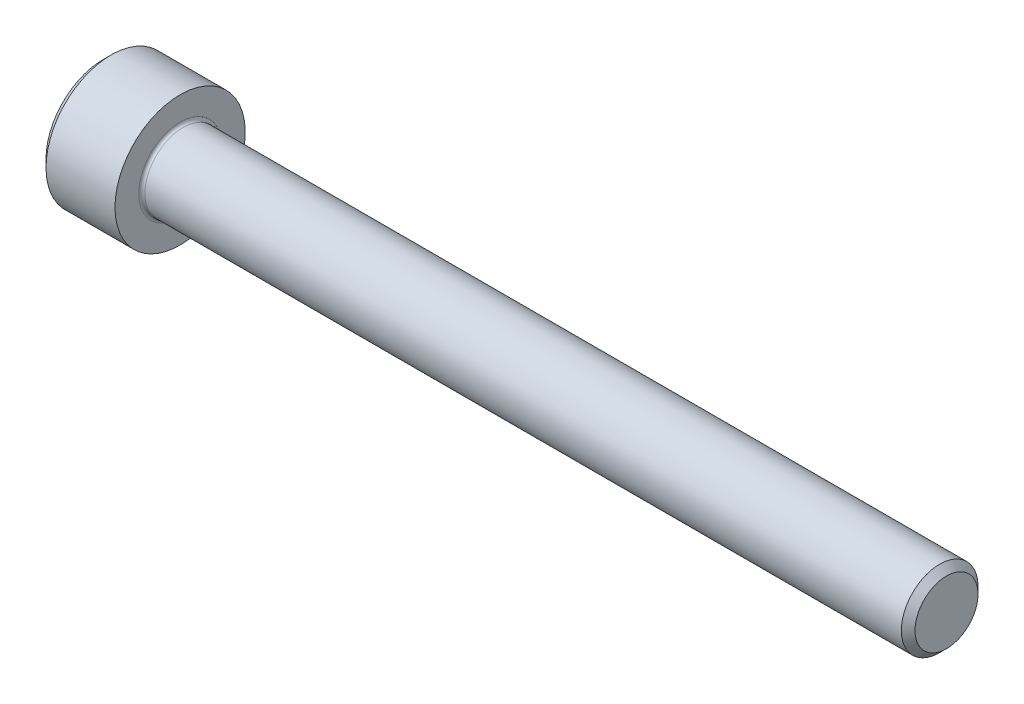
ISO-10303-21;
HEADER;
FILE_DESCRIPTION(('STEP AP214'),'2;1');
FILE_NAME('part.step','',(''),(''),'','','');
FILE_SCHEMA(('AUTOMOTIVE_DESIGN { 1 0 10303 214 1 1 1 1 }'));
ENDSEC;
DATA;
#1=APPLICATION_CONTEXT('core data for automotive mechanical design processes');
#2=APPLICATION_PROTOCOL_DEFINITION('international standard','automotive_design',2000,#1);
#3=PRODUCT_CONTEXT('',#1,'mechanical');
#4=PRODUCT('Part','Part','',(#3));
#5=PRODUCT_RELATED_PRODUCT_CATEGORY('part','',(#4));
#6=PRODUCT_DEFINITION_FORMATION('','',#4);
#7=PRODUCT_DEFINITION_CONTEXT('part definition',#1,'design');
#8=PRODUCT_DEFINITION('design','',#6,#7);
#9=PRODUCT_DEFINITION_SHAPE('','',#8);
#10=(LENGTH_UNIT() NAMED_UNIT(*) SI_UNIT(.MILLI.,.METRE.));
#11=(NAMED_UNIT(*) PLANE_ANGLE_UNIT() SI_UNIT($,.RADIAN.));
#12=(NAMED_UNIT(*) SI_UNIT($,.STERADIAN.) SOLID_ANGLE_UNIT());
#13=UNCERTAINTY_MEASURE_WITH_UNIT(LENGTH_MEASURE(1.E-05),#10,'distance_accuracy_value','');
#14=(GEOMETRIC_REPRESENTATION_CONTEXT(3) GLOBAL_UNCERTAINTY_ASSIGNED_CONTEXT((#13)) GLOBAL_UNIT_ASSIGNED_CONTEXT((#10,
#11,#12)) REPRESENTATION_CONTEXT('',''));
#15=CARTESIAN_POINT('',(0.,0.,0.));
#16=DIRECTION('',(0.,0.,1.));
#17=DIRECTION('',(1.,0.,0.));
#18=AXIS2_PLACEMENT_3D('',#15,#16,#17);
#19=CARTESIAN_POINT('',(0.,0.,0.));
#20=DIRECTION('',(-1.,0.,0.));
#21=DIRECTION('',(0.,0.,1.));
#22=AXIS2_PLACEMENT_3D('',#19,#20,#21);
#23=PLANE('',#22);
#24=DIRECTION('',(0.,-0.499999999999999,0.866025403784439));
#25=VECTOR('',#24,1.);
#26=CARTESIAN_POINT('',(0.,2.35789849937043,0.));
#27=LINE('',#26,#25);
#28=CARTESIAN_POINT('',(0.,2.35789849937043,0.));
#29=VERTEX_POINT('',#28);
#30=CARTESIAN_POINT('',(0.,1.17894924968522,2.042));
#31=VERTEX_POINT('',#30);
#32=EDGE_CURVE('E296',#29,#31,#27,.T.);
#33=ORIENTED_EDGE('',*,*,#32,.T.);
#34=DIRECTION('',(0.,1.,0.));
#35=VECTOR('',#34,1.);
#36=CARTESIAN_POINT('',(0.,-1.17894924968521,2.042));
#37=LINE('',#36,#35);
#38=CARTESIAN_POINT('',(0.,-1.17894924968521,2.042));
#39=VERTEX_POINT('',#38);
#40=EDGE_CURVE('E139',#39,#31,#37,.T.);
#41=ORIENTED_EDGE('',*,*,#40,.F.);
#42=DIRECTION('',(0.,-0.500000000000001,-0.866025403784438));
#43=VECTOR('',#42,1.);
#44=CARTESIAN_POINT('',(0.,-1.17894924968521,2.042));
#45=LINE('',#44,#43);
#46=CARTESIAN_POINT('',(0.,-2.35789849937043,0.));
#47=VERTEX_POINT('',#46);
#48=EDGE_CURVE('E301',#39,#47,#45,.T.);
#49=ORIENTED_EDGE('',*,*,#48,.T.);
#50=DIRECTION('',(0.,0.499999999999999,-0.866025403784439));
#51=VECTOR('',#50,1.);
#52=CARTESIAN_POINT('',(0.,-2.35789849937043,0.));
#53=LINE('',#52,#51);
#54=CARTESIAN_POINT('',(0.,-1.17894924968522,-2.042));
#55=VERTEX_POINT('',#54);
#56=EDGE_CURVE('E305',#47,#55,#53,.T.);
#57=ORIENTED_EDGE('',*,*,#56,.T.);
#58=DIRECTION('',(0.,-1.,0.));
#59=VECTOR('',#58,1.);
#60=CARTESIAN_POINT('',(0.,1.17894924968521,-2.042));
#61=LINE('',#60,#59);
#62=CARTESIAN_POINT('',(0.,1.17894924968521,-2.042));
#63=VERTEX_POINT('',#62);
#64=EDGE_CURVE('E309',#63,#55,#61,.T.);
#65=ORIENTED_EDGE('',*,*,#64,.F.);
#66=DIRECTION('',(0.,-0.500000000000001,-0.866025403784438));
#67=VECTOR('',#66,1.);
#68=CARTESIAN_POINT('',(0.,2.35789849937043,0.));
#69=LINE('',#68,#67);
#70=EDGE_CURVE('E134',#29,#63,#69,.T.);
#71=ORIENTED_EDGE('',*,*,#70,.F.);
#72=EDGE_LOOP('',(#33,#41,#49,#57,#65,#71));
#73=FACE_BOUND('',#72,.T.);
#74=CARTESIAN_POINT('',(0.,0.,0.));
#75=DIRECTION('',(-1.,0.,0.));
#76=DIRECTION('',(0.,0.,1.));
#77=AXIS2_PLACEMENT_3D('',#74,#75,#76);
#78=CIRCLE('',#77,3.75);
#79=CARTESIAN_POINT('',(0.,0.,3.75));
#80=VERTEX_POINT('',#79);
#81=EDGE_CURVE('E171',#80,#80,#78,.T.);
#82=ORIENTED_EDGE('',*,*,#81,.T.);
#83=EDGE_LOOP('',(#82));
#84=FACE_BOUND('',#83,.T.);
#85=ADVANCED_FACE('F44',(#73,#84),#23,.T.);
#86=CARTESIAN_POINT('',(0.,0.,0.));
#87=DIRECTION('',(1.,0.,0.));
#88=DIRECTION('',(0.,0.,-1.));
#89=AXIS2_PLACEMENT_3D('',#86,#87,#88);
#90=CONICAL_SURFACE('',#89,3.75,0.785398163397449);
#91=CARTESIAN_POINT('',(0.5,0.,0.));
#92=DIRECTION('',(-1.,0.,0.));
#93=DIRECTION('',(0.,0.,1.));
#94=AXIS2_PLACEMENT_3D('',#91,#92,#93);
#95=CIRCLE('',#94,4.25);
#96=CARTESIAN_POINT('',(0.5,0.,4.25));
#97=VERTEX_POINT('',#96);
#98=EDGE_CURVE('E167',#97,#97,#95,.T.);
#99=ORIENTED_EDGE('',*,*,#98,.T.);
#100=EDGE_LOOP('',(#99));
#101=FACE_BOUND('',#100,.T.);
#102=ORIENTED_EDGE('',*,*,#81,.F.);
#103=EDGE_LOOP('',(#102));
#104=FACE_BOUND('',#103,.T.);
#105=ADVANCED_FACE('F194',(#101,#104),#90,.T.);
#106=CARTESIAN_POINT('',(-31.75,0.,0.));
#107=DIRECTION('',(-1.,0.,0.));
#108=DIRECTION('',(0.,0.,1.));
#109=AXIS2_PLACEMENT_3D('',#106,#107,#108);
#110=CYLINDRICAL_SURFACE('',#109,4.25);
#111=CARTESIAN_POINT('',(5.,0.,0.));
#112=DIRECTION('',(-1.,0.,0.));
#113=DIRECTION('',(0.,0.,1.));
#114=AXIS2_PLACEMENT_3D('',#111,#112,#113);
#115=CIRCLE('',#114,4.25);
#116=CARTESIAN_POINT('',(5.,0.,4.25));
#117=VERTEX_POINT('',#116);
#118=EDGE_CURVE('E163',#117,#117,#115,.T.);
#119=ORIENTED_EDGE('',*,*,#118,.T.);
#120=EDGE_LOOP('',(#119));
#121=FACE_BOUND('',#120,.T.);
#122=ORIENTED_EDGE('',*,*,#98,.F.);
#123=EDGE_LOOP('',(#122));
#124=FACE_BOUND('',#123,.T.);
#125=ADVANCED_FACE('F199',(#121,#124),#110,.T.);
#126=CARTESIAN_POINT('',(5.,4.25,0.));
#127=DIRECTION('',(1.,0.,0.));
#128=DIRECTION('',(0.,0.,-1.));
#129=AXIS2_PLACEMENT_3D('',#126,#127,#128);
#130=PLANE('',#129);
#131=CARTESIAN_POINT('',(5.,0.,0.));
#132=DIRECTION('',(1.,0.,0.));
#133=DIRECTION('',(0.,0.,-1.));
#134=AXIS2_PLACEMENT_3D('',#131,#132,#133);
#135=CIRCLE('',#134,2.70000000000002);
#136=CARTESIAN_POINT('',(5.,0.,-2.70000000000002));
#137=VERTEX_POINT('',#136);
#138=EDGE_CURVE('E53',#137,#137,#135,.F.);
#139=ORIENTED_EDGE('',*,*,#138,.T.);
#140=EDGE_LOOP('',(#139));
#141=FACE_BOUND('',#140,.T.);
#142=ORIENTED_EDGE('',*,*,#118,.F.);
#143=EDGE_LOOP('',(#142));
#144=FACE_BOUND('',#143,.T.);
#145=ADVANCED_FACE('F178',(#141,#144),#130,.T.);
#146=CARTESIAN_POINT('',(-31.75,0.,0.));
#147=DIRECTION('',(-1.,0.,0.));
#148=DIRECTION('',(0.,0.,1.));
#149=AXIS2_PLACEMENT_3D('',#146,#147,#148);
#150=CYLINDRICAL_SURFACE('',#149,2.50000000000002);
#151=CARTESIAN_POINT('',(5.2,0.,0.));
#152=DIRECTION('',(1.,0.,0.));
#153=DIRECTION('',(0.,0.,-1.));
#154=AXIS2_PLACEMENT_3D('',#151,#152,#153);
#155=CIRCLE('',#154,2.50000000000002);
#156=CARTESIAN_POINT('',(5.2,0.,-2.50000000000002));
#157=VERTEX_POINT('',#156);
#158=EDGE_CURVE('E11',#157,#157,#155,.T.);
#159=ORIENTED_EDGE('',*,*,#158,.T.);
#160=EDGE_LOOP('',(#159));
#161=FACE_BOUND('',#160,.T.);
#162=CARTESIAN_POINT('',(54.5550000000001,0.,0.));
#163=DIRECTION('',(-1.,0.,0.));
#164=DIRECTION('',(0.,0.,1.));
#165=AXIS2_PLACEMENT_3D('',#162,#163,#164);
#166=CIRCLE('',#165,2.50000000000003);
#167=CARTESIAN_POINT('',(54.5550000000001,0.,2.50000000000003));
#168=VERTEX_POINT('',#167);
#169=EDGE_CURVE('E159',#168,#168,#166,.T.);
#170=ORIENTED_EDGE('',*,*,#169,.T.);
#171=EDGE_LOOP('',(#170));
#172=FACE_BOUND('',#171,.T.);
#173=ADVANCED_FACE('F209',(#161,#172),#150,.T.);
#174=CARTESIAN_POINT('',(55.,0.,0.));
#175=DIRECTION('',(-1.,0.,0.));
#176=DIRECTION('',(0.,0.,1.));
#177=AXIS2_PLACEMENT_3D('',#174,#175,#176);
#178=CONICAL_SURFACE('',#177,2.055,0.785398163397547);
#179=ORIENTED_EDGE('',*,*,#169,.F.);
#180=EDGE_LOOP('',(#179));
#181=FACE_BOUND('',#180,.T.);
#182=CARTESIAN_POINT('',(55.,0.,0.));
#183=DIRECTION('',(-1.,0.,0.));
#184=DIRECTION('',(0.,0.,1.));
#185=AXIS2_PLACEMENT_3D('',#182,#183,#184);
#186=CIRCLE('',#185,2.055);
#187=CARTESIAN_POINT('',(55.,0.,2.055));
#188=VERTEX_POINT('',#187);
#189=EDGE_CURVE('E154',#188,#188,#186,.T.);
#190=ORIENTED_EDGE('',*,*,#189,.T.);
#191=EDGE_LOOP('',(#190));
#192=FACE_BOUND('',#191,.T.);
#193=ADVANCED_FACE('F189',(#181,#192),#178,.T.);
#194=CARTESIAN_POINT('',(55.,2.055,0.));
#195=DIRECTION('',(1.,0.,0.));
#196=DIRECTION('',(0.,0.,-1.));
#197=AXIS2_PLACEMENT_3D('',#194,#195,#196);
#198=PLANE('',#197);
#199=ORIENTED_EDGE('',*,*,#189,.F.);
#200=EDGE_LOOP('',(#199));
#201=FACE_BOUND('',#200,.T.);
#202=ADVANCED_FACE('F182',(#201),#198,.T.);
#203=CARTESIAN_POINT('',(5.2,0.,0.));
#204=DIRECTION('',(1.,0.,0.));
#205=DIRECTION('',(0.,0.,-1.));
#206=AXIS2_PLACEMENT_3D('',#203,#204,#205);
#207=TOROIDAL_SURFACE('',#206,2.70000000000002,0.2);
#208=ORIENTED_EDGE('',*,*,#158,.F.);
#209=EDGE_LOOP('',(#208));
#210=FACE_BOUND('',#209,.T.);
#211=ORIENTED_EDGE('',*,*,#138,.F.);
#212=EDGE_LOOP('',(#211));
#213=FACE_BOUND('',#212,.T.);
#214=ADVANCED_FACE('F46',(#210,#213),#207,.F.);
#215=CARTESIAN_POINT('',(2.5,2.35789849937043,0.));
#216=DIRECTION('',(0.,-0.866025403784439,-0.499999999999999));
#217=DIRECTION('',(0.,0.499999999999999,-0.866025403784439));
#218=AXIS2_PLACEMENT_3D('',#215,#216,#217);
#219=PLANE('',#218);
#220=ORIENTED_EDGE('',*,*,#32,.F.);
#221=DIRECTION('',(-1.,0.,0.));
#222=VECTOR('',#221,1.);
#223=CARTESIAN_POINT('',(2.5,2.35789849937043,0.));
#224=LINE('',#223,#222);
#225=CARTESIAN_POINT('',(2.5,2.35789849937043,0.));
#226=VERTEX_POINT('',#225);
#227=EDGE_CURVE('E295',#226,#29,#224,.T.);
#228=ORIENTED_EDGE('',*,*,#227,.F.);
#229=DIRECTION('',(0.,-0.499999999999999,0.866025403784439));
#230=VECTOR('',#229,1.);
#231=CARTESIAN_POINT('',(2.5,2.35789849937043,0.));
#232=LINE('',#231,#230);
#233=CARTESIAN_POINT('',(2.5,1.76842387452783,1.021));
#234=VERTEX_POINT('',#233);
#235=EDGE_CURVE('E60',#226,#234,#232,.T.);
#236=ORIENTED_EDGE('',*,*,#235,.T.);
#237=CARTESIAN_POINT('',(2.5,1.17894924968522,2.042));
#238=VERTEX_POINT('',#237);
#239=EDGE_CURVE('E118',#234,#238,#232,.T.);
#240=ORIENTED_EDGE('',*,*,#239,.T.);
#241=DIRECTION('',(-1.,0.,0.));
#242=VECTOR('',#241,1.);
#243=CARTESIAN_POINT('',(2.5,1.17894924968522,2.042));
#244=LINE('',#243,#242);
#245=EDGE_CURVE('E131',#238,#31,#244,.T.);
#246=ORIENTED_EDGE('',*,*,#245,.T.);
#247=EDGE_LOOP('',(#220,#228,#236,#240,#246));
#248=FACE_BOUND('',#247,.T.);
#249=ADVANCED_FACE('F130',(#248),#219,.T.);
#250=CARTESIAN_POINT('',(2.5,-1.17894924968521,2.042));
#251=DIRECTION('',(0.,0.,1.));
#252=DIRECTION('',(0.,-1.,0.));
#253=AXIS2_PLACEMENT_3D('',#250,#251,#252);
#254=PLANE('',#253);
#255=ORIENTED_EDGE('',*,*,#40,.T.);
#256=ORIENTED_EDGE('',*,*,#245,.F.);
#257=DIRECTION('',(0.,1.,0.));
#258=VECTOR('',#257,1.);
#259=CARTESIAN_POINT('',(2.5,-1.17894924968521,2.042));
#260=LINE('',#259,#258);
#261=CARTESIAN_POINT('',(2.5,0.,2.042));
#262=VERTEX_POINT('',#261);
#263=EDGE_CURVE('E116',#262,#238,#260,.T.);
#264=ORIENTED_EDGE('',*,*,#263,.F.);
#265=CARTESIAN_POINT('',(2.5,-1.17894924968521,2.042));
#266=VERTEX_POINT('',#265);
#267=EDGE_CURVE('E127',#266,#262,#260,.T.);
#268=ORIENTED_EDGE('',*,*,#267,.F.);
#269=DIRECTION('',(-1.,0.,0.));
#270=VECTOR('',#269,1.);
#271=CARTESIAN_POINT('',(2.5,-1.17894924968521,2.042));
#272=LINE('',#271,#270);
#273=EDGE_CURVE('E142',#266,#39,#272,.T.);
#274=ORIENTED_EDGE('',*,*,#273,.T.);
#275=EDGE_LOOP('',(#255,#256,#264,#268,#274));
#276=FACE_BOUND('',#275,.T.);
#277=ADVANCED_FACE('F136',(#276),#254,.F.);
#278=CARTESIAN_POINT('',(2.5,-1.17894924968521,2.042));
#279=DIRECTION('',(0.,0.866025403784438,-0.500000000000001));
#280=DIRECTION('',(0.,0.500000000000001,0.866025403784438));
#281=AXIS2_PLACEMENT_3D('',#278,#279,#280);
#282=PLANE('',#281);
#283=ORIENTED_EDGE('',*,*,#48,.F.);
#284=ORIENTED_EDGE('',*,*,#273,.F.);
#285=DIRECTION('',(0.,-0.500000000000001,-0.866025403784438));
#286=VECTOR('',#285,1.);
#287=CARTESIAN_POINT('',(2.5,-1.17894924968521,2.042));
#288=LINE('',#287,#286);
#289=CARTESIAN_POINT('',(2.5,-1.76842387452782,1.021));
#290=VERTEX_POINT('',#289);
#291=EDGE_CURVE('E270',#266,#290,#288,.T.);
#292=ORIENTED_EDGE('',*,*,#291,.T.);
#293=CARTESIAN_POINT('',(2.5,-2.35789849937043,0.));
#294=VERTEX_POINT('',#293);
#295=EDGE_CURVE('E272',#290,#294,#288,.T.);
#296=ORIENTED_EDGE('',*,*,#295,.T.);
#297=DIRECTION('',(-1.,0.,0.));
#298=VECTOR('',#297,1.);
#299=CARTESIAN_POINT('',(2.5,-2.35789849937043,0.));
#300=LINE('',#299,#298);
#301=EDGE_CURVE('E149',#294,#47,#300,.T.);
#302=ORIENTED_EDGE('',*,*,#301,.T.);
#303=EDGE_LOOP('',(#283,#284,#292,#296,#302));
#304=FACE_BOUND('',#303,.T.);
#305=ADVANCED_FACE('F221',(#304),#282,.T.);
#306=CARTESIAN_POINT('',(2.5,-2.35789849937043,0.));
#307=DIRECTION('',(0.,0.866025403784439,0.499999999999999));
#308=DIRECTION('',(0.,-0.499999999999999,0.866025403784439));
#309=AXIS2_PLACEMENT_3D('',#306,#307,#308);
#310=PLANE('',#309);
#311=ORIENTED_EDGE('',*,*,#56,.F.);
#312=ORIENTED_EDGE('',*,*,#301,.F.);
#313=DIRECTION('',(0.,0.499999999999999,-0.866025403784439));
#314=VECTOR('',#313,1.);
#315=CARTESIAN_POINT('',(2.5,-2.35789849937043,0.));
#316=LINE('',#315,#314);
#317=CARTESIAN_POINT('',(2.5,-1.76842387452782,-1.021));
#318=VERTEX_POINT('',#317);
#319=EDGE_CURVE('E275',#294,#318,#316,.T.);
#320=ORIENTED_EDGE('',*,*,#319,.T.);
#321=CARTESIAN_POINT('',(2.5,-1.17894924968522,-2.042));
#322=VERTEX_POINT('',#321);
#323=EDGE_CURVE('E281',#318,#322,#316,.T.);
#324=ORIENTED_EDGE('',*,*,#323,.T.);
#325=DIRECTION('',(-1.,0.,0.));
#326=VECTOR('',#325,1.);
#327=CARTESIAN_POINT('',(2.5,-1.17894924968522,-2.042));
#328=LINE('',#327,#326);
#329=EDGE_CURVE('E322',#322,#55,#328,.T.);
#330=ORIENTED_EDGE('',*,*,#329,.T.);
#331=EDGE_LOOP('',(#311,#312,#320,#324,#330));
#332=FACE_BOUND('',#331,.T.);
#333=ADVANCED_FACE('F224',(#332),#310,.T.);
#334=CARTESIAN_POINT('',(2.5,1.17894924968521,-2.042));
#335=DIRECTION('',(0.,0.,-1.));
#336=DIRECTION('',(0.,1.,0.));
#337=AXIS2_PLACEMENT_3D('',#334,#335,#336);
#338=PLANE('',#337);
#339=ORIENTED_EDGE('',*,*,#64,.T.);
#340=ORIENTED_EDGE('',*,*,#329,.F.);
#341=DIRECTION('',(0.,-1.,0.));
#342=VECTOR('',#341,1.);
#343=CARTESIAN_POINT('',(2.5,1.17894924968521,-2.042));
#344=LINE('',#343,#342);
#345=CARTESIAN_POINT('',(2.5,0.,-2.042));
#346=VERTEX_POINT('',#345);
#347=EDGE_CURVE('E287',#346,#322,#344,.T.);
#348=ORIENTED_EDGE('',*,*,#347,.F.);
#349=CARTESIAN_POINT('',(2.5,1.17894924968521,-2.042));
#350=VERTEX_POINT('',#349);
#351=EDGE_CURVE('E288',#350,#346,#344,.T.);
#352=ORIENTED_EDGE('',*,*,#351,.F.);
#353=DIRECTION('',(-1.,0.,0.));
#354=VECTOR('',#353,1.);
#355=CARTESIAN_POINT('',(2.5,1.17894924968521,-2.042));
#356=LINE('',#355,#354);
#357=EDGE_CURVE('E318',#350,#63,#356,.T.);
#358=ORIENTED_EDGE('',*,*,#357,.T.);
#359=EDGE_LOOP('',(#339,#340,#348,#352,#358));
#360=FACE_BOUND('',#359,.T.);
#361=ADVANCED_FACE('F228',(#360),#338,.F.);
#362=CARTESIAN_POINT('',(2.5,2.35789849937043,0.));
#363=DIRECTION('',(0.,0.866025403784438,-0.500000000000001));
#364=DIRECTION('',(0.,0.500000000000001,0.866025403784438));
#365=AXIS2_PLACEMENT_3D('',#362,#363,#364);
#366=PLANE('',#365);
#367=ORIENTED_EDGE('',*,*,#70,.T.);
#368=ORIENTED_EDGE('',*,*,#357,.F.);
#369=DIRECTION('',(0.,-0.500000000000001,-0.866025403784438));
#370=VECTOR('',#369,1.);
#371=CARTESIAN_POINT('',(2.5,2.35789849937043,0.));
#372=LINE('',#371,#370);
#373=CARTESIAN_POINT('',(2.5,1.76842387452782,-1.021));
#374=VERTEX_POINT('',#373);
#375=EDGE_CURVE('E292',#374,#350,#372,.T.);
#376=ORIENTED_EDGE('',*,*,#375,.F.);
#377=EDGE_CURVE('E260',#226,#374,#372,.T.);
#378=ORIENTED_EDGE('',*,*,#377,.F.);
#379=ORIENTED_EDGE('',*,*,#227,.T.);
#380=EDGE_LOOP('',(#367,#368,#376,#378,#379));
#381=FACE_BOUND('',#380,.T.);
#382=ADVANCED_FACE('F232',(#381),#366,.F.);
#383=CARTESIAN_POINT('',(2.5,1.17894924968522,2.042));
#384=DIRECTION('',(-1.,0.,0.));
#385=DIRECTION('',(0.,0.,1.));
#386=AXIS2_PLACEMENT_3D('',#383,#384,#385);
#387=PLANE('',#386);
#388=CARTESIAN_POINT('',(2.5,0.,0.));
#389=DIRECTION('',(-1.,0.,0.));
#390=DIRECTION('',(0.,0.,1.));
#391=AXIS2_PLACEMENT_3D('',#388,#389,#390);
#392=CIRCLE('',#391,2.042);
#393=EDGE_CURVE('E141',#290,#262,#392,.T.);
#394=ORIENTED_EDGE('',*,*,#393,.F.);
#395=ORIENTED_EDGE('',*,*,#291,.F.);
#396=ORIENTED_EDGE('',*,*,#267,.T.);
#397=EDGE_LOOP('',(#394,#395,#396));
#398=FACE_BOUND('',#397,.T.);
#399=ADVANCED_FACE('F236',(#398),#387,.T.);
#400=EDGE_CURVE('E147',#318,#290,#392,.T.);
#401=ORIENTED_EDGE('',*,*,#400,.F.);
#402=ORIENTED_EDGE('',*,*,#319,.F.);
#403=ORIENTED_EDGE('',*,*,#295,.F.);
#404=EDGE_LOOP('',(#401,#402,#403));
#405=FACE_BOUND('',#404,.T.);
#406=ADVANCED_FACE('F239',(#405),#387,.T.);
#407=EDGE_CURVE('E334',#346,#318,#392,.T.);
#408=ORIENTED_EDGE('',*,*,#407,.F.);
#409=ORIENTED_EDGE('',*,*,#347,.T.);
#410=ORIENTED_EDGE('',*,*,#323,.F.);
#411=EDGE_LOOP('',(#408,#409,#410));
#412=FACE_BOUND('',#411,.T.);
#413=ADVANCED_FACE('F244',(#412),#387,.T.);
#414=EDGE_CURVE('E264',#374,#346,#392,.T.);
#415=ORIENTED_EDGE('',*,*,#414,.F.);
#416=ORIENTED_EDGE('',*,*,#375,.T.);
#417=ORIENTED_EDGE('',*,*,#351,.T.);
#418=EDGE_LOOP('',(#415,#416,#417));
#419=FACE_BOUND('',#418,.T.);
#420=ADVANCED_FACE('F251',(#419),#387,.T.);
#421=EDGE_CURVE('E155',#234,#374,#392,.T.);
#422=ORIENTED_EDGE('',*,*,#421,.F.);
#423=ORIENTED_EDGE('',*,*,#235,.F.);
#424=ORIENTED_EDGE('',*,*,#377,.T.);
#425=EDGE_LOOP('',(#422,#423,#424));
#426=FACE_BOUND('',#425,.T.);
#427=ADVANCED_FACE('F247',(#426),#387,.T.);
#428=EDGE_CURVE('E121',#262,#234,#392,.T.);
#429=ORIENTED_EDGE('',*,*,#428,.F.);
#430=ORIENTED_EDGE('',*,*,#263,.T.);
#431=ORIENTED_EDGE('',*,*,#239,.F.);
#432=EDGE_LOOP('',(#429,#430,#431));
#433=FACE_BOUND('',#432,.T.);
#434=ADVANCED_FACE('F117',(#433),#387,.T.);
#435=CARTESIAN_POINT('',(2.5,0.,0.));
#436=DIRECTION('',(-1.,0.,0.));
#437=DIRECTION('',(0.,0.,1.));
#438=AXIS2_PLACEMENT_3D('',#435,#436,#437);
#439=CONICAL_SURFACE('',#438,2.042,1.04719755119659);
#440=CARTESIAN_POINT('',(3.67894924968522,0.,0.));
#441=VERTEX_POINT('',#440);
#442=VERTEX_LOOP('',#441);
#443=FACE_BOUND('',#442,.T.);
#444=ORIENTED_EDGE('',*,*,#428,.T.);
#445=ORIENTED_EDGE('',*,*,#421,.T.);
#446=ORIENTED_EDGE('',*,*,#414,.T.);
#447=ORIENTED_EDGE('',*,*,#407,.T.);
#448=ORIENTED_EDGE('',*,*,#400,.T.);
#449=ORIENTED_EDGE('',*,*,#393,.T.);
#450=EDGE_LOOP('',(#444,#445,#446,#447,#448,#449));
#451=FACE_BOUND('',#450,.T.);
#452=ADVANCED_FACE('F216',(#443,#451),#439,.F.);
#453=CLOSED_SHELL('',(#85,#105,#125,#145,#173,#193,#202,#214,#249,#277,#305,#333,#361,#382,#399,
#406,#413,#420,#427,#434,#452));
#454=MANIFOLD_SOLID_BREP('B2',#453);
#455=ADVANCED_BREP_SHAPE_REPRESENTATION('',(#18,#454),#14);
#456=SHAPE_DEFINITION_REPRESENTATION(#9,#455);
ENDSEC;
END-ISO-10303-21;
